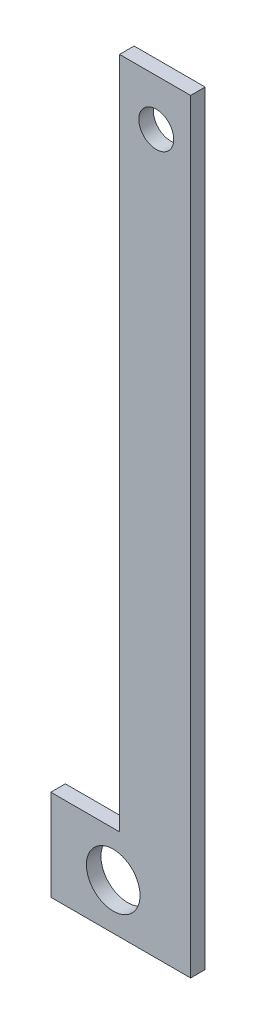
ISO-10303-21;
HEADER;
FILE_DESCRIPTION(('STEP AP214'),'2;1');
FILE_NAME('part.step','',(''),(''),'','','');
FILE_SCHEMA(('AUTOMOTIVE_DESIGN { 1 0 10303 214 1 1 1 1 }'));
ENDSEC;
DATA;
#1=APPLICATION_CONTEXT('core data for automotive mechanical design processes');
#2=APPLICATION_PROTOCOL_DEFINITION('international standard','automotive_design',2000,#1);
#3=PRODUCT_CONTEXT('',#1,'mechanical');
#4=PRODUCT('Part','Part','',(#3));
#5=PRODUCT_RELATED_PRODUCT_CATEGORY('part','',(#4));
#6=PRODUCT_DEFINITION_FORMATION('','',#4);
#7=PRODUCT_DEFINITION_CONTEXT('part definition',#1,'design');
#8=PRODUCT_DEFINITION('design','',#6,#7);
#9=PRODUCT_DEFINITION_SHAPE('','',#8);
#10=(LENGTH_UNIT() NAMED_UNIT(*) SI_UNIT(.MILLI.,.METRE.));
#11=(NAMED_UNIT(*) PLANE_ANGLE_UNIT() SI_UNIT($,.RADIAN.));
#12=(NAMED_UNIT(*) SI_UNIT($,.STERADIAN.) SOLID_ANGLE_UNIT());
#13=UNCERTAINTY_MEASURE_WITH_UNIT(LENGTH_MEASURE(1.E-05),#10,'distance_accuracy_value','');
#14=(GEOMETRIC_REPRESENTATION_CONTEXT(3) GLOBAL_UNCERTAINTY_ASSIGNED_CONTEXT((#13)) GLOBAL_UNIT_ASSIGNED_CONTEXT((#10,
#11,#12)) REPRESENTATION_CONTEXT('',''));
#15=CARTESIAN_POINT('',(0.,0.,0.));
#16=DIRECTION('',(0.,0.,1.));
#17=DIRECTION('',(1.,0.,0.));
#18=AXIS2_PLACEMENT_3D('',#15,#16,#17);
#19=CARTESIAN_POINT('',(-10.5266715270797,0.,3.));
#20=DIRECTION('',(-1.,0.,0.));
#21=DIRECTION('',(0.,0.,1.));
#22=AXIS2_PLACEMENT_3D('',#19,#20,#21);
#23=PLANE('',#22);
#24=DIRECTION('',(0.,1.,0.));
#25=VECTOR('',#24,1.);
#26=CARTESIAN_POINT('',(-10.5266715270797,0.,0.));
#27=LINE('',#26,#25);
#28=CARTESIAN_POINT('',(-10.5266715270797,-175.733774115841,0.));
#29=VERTEX_POINT('',#28);
#30=CARTESIAN_POINT('',(-10.5266715270797,-156.940093395301,0.));
#31=VERTEX_POINT('',#30);
#32=EDGE_CURVE('E127',#29,#31,#27,.T.);
#33=ORIENTED_EDGE('',*,*,#32,.F.);
#34=DIRECTION('',(0.,0.,-1.));
#35=VECTOR('',#34,1.);
#36=CARTESIAN_POINT('',(-10.5266715270797,-175.733774115841,3.));
#37=LINE('',#36,#35);
#38=CARTESIAN_POINT('',(-10.5266715270797,-175.733774115841,3.));
#39=VERTEX_POINT('',#38);
#40=EDGE_CURVE('E11',#39,#29,#37,.T.);
#41=ORIENTED_EDGE('',*,*,#40,.F.);
#42=DIRECTION('',(0.,1.,0.));
#43=VECTOR('',#42,1.);
#44=CARTESIAN_POINT('',(-10.5266715270797,0.,3.));
#45=LINE('',#44,#43);
#46=CARTESIAN_POINT('',(-10.5266715270797,-156.940093395301,3.));
#47=VERTEX_POINT('',#46);
#48=EDGE_CURVE('E183',#39,#47,#45,.T.);
#49=ORIENTED_EDGE('',*,*,#48,.T.);
#50=DIRECTION('',(0.,0.,-1.));
#51=VECTOR('',#50,1.);
#52=CARTESIAN_POINT('',(-10.5266715270797,-156.940093395301,3.));
#53=LINE('',#52,#51);
#54=EDGE_CURVE('E81',#47,#31,#53,.T.);
#55=ORIENTED_EDGE('',*,*,#54,.T.);
#56=EDGE_LOOP('',(#33,#41,#49,#55));
#57=FACE_BOUND('',#56,.T.);
#58=ADVANCED_FACE('F35',(#57),#23,.T.);
#59=CARTESIAN_POINT('',(0.,-175.733774115841,3.));
#60=DIRECTION('',(0.,-1.,0.));
#61=DIRECTION('',(0.,0.,-1.));
#62=AXIS2_PLACEMENT_3D('',#59,#60,#61);
#63=PLANE('',#62);
#64=DIRECTION('',(-1.,0.,0.));
#65=VECTOR('',#64,1.);
#66=CARTESIAN_POINT('',(0.,-175.733774115841,0.));
#67=LINE('',#66,#65);
#68=CARTESIAN_POINT('',(18.3464896356266,-175.733774115841,0.));
#69=VERTEX_POINT('',#68);
#70=EDGE_CURVE('E129',#69,#29,#67,.T.);
#71=ORIENTED_EDGE('',*,*,#70,.F.);
#72=DIRECTION('',(0.,0.,-1.));
#73=VECTOR('',#72,1.);
#74=CARTESIAN_POINT('',(18.3464896356266,-175.733774115841,3.));
#75=LINE('',#74,#73);
#76=CARTESIAN_POINT('',(18.3464896356266,-175.733774115841,3.));
#77=VERTEX_POINT('',#76);
#78=EDGE_CURVE('E44',#77,#69,#75,.T.);
#79=ORIENTED_EDGE('',*,*,#78,.F.);
#80=DIRECTION('',(-1.,0.,0.));
#81=VECTOR('',#80,1.);
#82=CARTESIAN_POINT('',(0.,-175.733774115841,3.));
#83=LINE('',#82,#81);
#84=EDGE_CURVE('E116',#77,#39,#83,.T.);
#85=ORIENTED_EDGE('',*,*,#84,.T.);
#86=ORIENTED_EDGE('',*,*,#40,.T.);
#87=EDGE_LOOP('',(#71,#79,#85,#86));
#88=FACE_BOUND('',#87,.T.);
#89=ADVANCED_FACE('F148',(#88),#63,.T.);
#90=CARTESIAN_POINT('',(18.3464896356266,0.,3.));
#91=DIRECTION('',(1.,0.,0.));
#92=DIRECTION('',(0.,0.,-1.));
#93=AXIS2_PLACEMENT_3D('',#90,#91,#92);
#94=PLANE('',#93);
#95=DIRECTION('',(0.,-1.,0.));
#96=VECTOR('',#95,1.);
#97=CARTESIAN_POINT('',(18.3464896356266,0.,0.));
#98=LINE('',#97,#96);
#99=CARTESIAN_POINT('',(18.3464896356266,-17.887190202817,0.));
#100=VERTEX_POINT('',#99);
#101=EDGE_CURVE('E132',#100,#69,#98,.T.);
#102=ORIENTED_EDGE('',*,*,#101,.F.);
#103=DIRECTION('',(0.,0.,-1.));
#104=VECTOR('',#103,1.);
#105=CARTESIAN_POINT('',(18.3464896356266,-17.887190202817,3.));
#106=LINE('',#105,#104);
#107=CARTESIAN_POINT('',(18.3464896356266,-17.887190202817,3.));
#108=VERTEX_POINT('',#107);
#109=EDGE_CURVE('E103',#108,#100,#106,.T.);
#110=ORIENTED_EDGE('',*,*,#109,.F.);
#111=DIRECTION('',(0.,-1.,0.));
#112=VECTOR('',#111,1.);
#113=CARTESIAN_POINT('',(18.3464896356266,0.,3.));
#114=LINE('',#113,#112);
#115=EDGE_CURVE('E114',#108,#77,#114,.T.);
#116=ORIENTED_EDGE('',*,*,#115,.T.);
#117=ORIENTED_EDGE('',*,*,#78,.T.);
#118=EDGE_LOOP('',(#102,#110,#116,#117));
#119=FACE_BOUND('',#118,.T.);
#120=ADVANCED_FACE('F145',(#119),#94,.T.);
#121=CARTESIAN_POINT('',(0.,-17.887190202817,3.));
#122=DIRECTION('',(0.,1.,0.));
#123=DIRECTION('',(0.,0.,1.));
#124=AXIS2_PLACEMENT_3D('',#121,#122,#123);
#125=PLANE('',#124);
#126=DIRECTION('',(1.,0.,0.));
#127=VECTOR('',#126,1.);
#128=CARTESIAN_POINT('',(0.,-17.887190202817,0.));
#129=LINE('',#128,#127);
#130=CARTESIAN_POINT('',(3.66616636260827,-17.887190202817,0.));
#131=VERTEX_POINT('',#130);
#132=EDGE_CURVE('E100',#131,#100,#129,.T.);
#133=ORIENTED_EDGE('',*,*,#132,.F.);
#134=DIRECTION('',(0.,0.,-1.));
#135=VECTOR('',#134,1.);
#136=CARTESIAN_POINT('',(3.66616636260827,-17.887190202817,3.));
#137=LINE('',#136,#135);
#138=CARTESIAN_POINT('',(3.66616636260827,-17.887190202817,3.));
#139=VERTEX_POINT('',#138);
#140=EDGE_CURVE('E94',#139,#131,#137,.T.);
#141=ORIENTED_EDGE('',*,*,#140,.F.);
#142=DIRECTION('',(1.,0.,0.));
#143=VECTOR('',#142,1.);
#144=CARTESIAN_POINT('',(0.,-17.887190202817,3.));
#145=LINE('',#144,#143);
#146=EDGE_CURVE('E98',#139,#108,#145,.T.);
#147=ORIENTED_EDGE('',*,*,#146,.T.);
#148=ORIENTED_EDGE('',*,*,#109,.T.);
#149=EDGE_LOOP('',(#133,#141,#147,#148));
#150=FACE_BOUND('',#149,.T.);
#151=ADVANCED_FACE('F96',(#150),#125,.T.);
#152=CARTESIAN_POINT('',(3.66616636260827,0.,3.));
#153=DIRECTION('',(1.,0.,0.));
#154=DIRECTION('',(0.,1.,0.));
#155=AXIS2_PLACEMENT_3D('',#152,#153,#154);
#156=PLANE('',#155);
#157=DIRECTION('',(0.,-1.,0.));
#158=VECTOR('',#157,1.);
#159=CARTESIAN_POINT('',(3.66616636260827,0.,0.));
#160=LINE('',#159,#158);
#161=CARTESIAN_POINT('',(3.66616636260827,-156.940093395301,0.));
#162=VERTEX_POINT('',#161);
#163=EDGE_CURVE('E136',#131,#162,#160,.T.);
#164=ORIENTED_EDGE('',*,*,#163,.T.);
#165=DIRECTION('',(0.,0.,-1.));
#166=VECTOR('',#165,1.);
#167=CARTESIAN_POINT('',(3.66616636260827,-156.940093395301,3.));
#168=LINE('',#167,#166);
#169=CARTESIAN_POINT('',(3.66616636260827,-156.940093395301,3.));
#170=VERTEX_POINT('',#169);
#171=EDGE_CURVE('E104',#170,#162,#168,.T.);
#172=ORIENTED_EDGE('',*,*,#171,.F.);
#173=DIRECTION('',(0.,-1.,0.));
#174=VECTOR('',#173,1.);
#175=CARTESIAN_POINT('',(3.66616636260827,0.,3.));
#176=LINE('',#175,#174);
#177=EDGE_CURVE('E107',#139,#170,#176,.T.);
#178=ORIENTED_EDGE('',*,*,#177,.F.);
#179=ORIENTED_EDGE('',*,*,#140,.T.);
#180=EDGE_LOOP('',(#164,#172,#178,#179));
#181=FACE_BOUND('',#180,.T.);
#182=ADVANCED_FACE('F108',(#181),#156,.F.);
#183=CARTESIAN_POINT('',(2.35723115612346,-166.225505798524,3.));
#184=DIRECTION('',(0.,0.,-1.));
#185=DIRECTION('',(-1.,0.,0.));
#186=AXIS2_PLACEMENT_3D('',#183,#184,#185);
#187=CYLINDRICAL_SURFACE('',#186,5.53692113350888);
#188=CARTESIAN_POINT('',(2.35723115612346,-166.225505798524,3.));
#189=DIRECTION('',(0.,0.,1.));
#190=DIRECTION('',(1.,0.,0.));
#191=AXIS2_PLACEMENT_3D('',#188,#189,#190);
#192=CIRCLE('',#191,5.53692113350888);
#193=CARTESIAN_POINT('',(7.89415228963234,-166.225505798524,3.));
#194=VERTEX_POINT('',#193);
#195=EDGE_CURVE('E180',#194,#194,#192,.T.);
#196=ORIENTED_EDGE('',*,*,#195,.T.);
#197=EDGE_LOOP('',(#196));
#198=FACE_BOUND('',#197,.T.);
#199=CARTESIAN_POINT('',(2.35723115612346,-166.225505798524,0.));
#200=DIRECTION('',(0.,0.,1.));
#201=DIRECTION('',(1.,0.,0.));
#202=AXIS2_PLACEMENT_3D('',#199,#200,#201);
#203=CIRCLE('',#202,5.53692113350888);
#204=CARTESIAN_POINT('',(7.89415228963234,-166.225505798524,0.));
#205=VERTEX_POINT('',#204);
#206=EDGE_CURVE('E124',#205,#205,#203,.T.);
#207=ORIENTED_EDGE('',*,*,#206,.F.);
#208=EDGE_LOOP('',(#207));
#209=FACE_BOUND('',#208,.T.);
#210=ADVANCED_FACE('F168',(#198,#209),#187,.F.);
#211=CARTESIAN_POINT('',(11.2499999999983,-27.5,3.));
#212=DIRECTION('',(0.,0.,-1.));
#213=DIRECTION('',(-1.,0.,0.));
#214=AXIS2_PLACEMENT_3D('',#211,#212,#213);
#215=CYLINDRICAL_SURFACE('',#214,3.604124075316);
#216=CARTESIAN_POINT('',(11.2499999999983,-27.5,3.));
#217=DIRECTION('',(0.,0.,1.));
#218=DIRECTION('',(1.,0.,0.));
#219=AXIS2_PLACEMENT_3D('',#216,#217,#218);
#220=CIRCLE('',#219,3.604124075316);
#221=CARTESIAN_POINT('',(14.8541240753143,-27.5,3.));
#222=VERTEX_POINT('',#221);
#223=EDGE_CURVE('E139',#222,#222,#220,.T.);
#224=ORIENTED_EDGE('',*,*,#223,.T.);
#225=EDGE_LOOP('',(#224));
#226=FACE_BOUND('',#225,.T.);
#227=CARTESIAN_POINT('',(11.2499999999983,-27.5,0.));
#228=DIRECTION('',(0.,0.,1.));
#229=DIRECTION('',(1.,0.,0.));
#230=AXIS2_PLACEMENT_3D('',#227,#228,#229);
#231=CIRCLE('',#230,3.604124075316);
#232=CARTESIAN_POINT('',(14.8541240753143,-27.5,0.));
#233=VERTEX_POINT('',#232);
#234=EDGE_CURVE('E121',#233,#233,#231,.T.);
#235=ORIENTED_EDGE('',*,*,#234,.F.);
#236=EDGE_LOOP('',(#235));
#237=FACE_BOUND('',#236,.T.);
#238=ADVANCED_FACE('F37',(#226,#237),#215,.F.);
#239=CARTESIAN_POINT('',(0.,-156.940093395301,3.));
#240=DIRECTION('',(0.,-1.,0.));
#241=DIRECTION('',(0.,0.,-1.));
#242=AXIS2_PLACEMENT_3D('',#239,#240,#241);
#243=PLANE('',#242);
#244=DIRECTION('',(-1.,0.,0.));
#245=VECTOR('',#244,1.);
#246=CARTESIAN_POINT('',(0.,-156.940093395301,0.));
#247=LINE('',#246,#245);
#248=EDGE_CURVE('E74',#162,#31,#247,.T.);
#249=ORIENTED_EDGE('',*,*,#248,.T.);
#250=ORIENTED_EDGE('',*,*,#54,.F.);
#251=DIRECTION('',(-1.,0.,0.));
#252=VECTOR('',#251,1.);
#253=CARTESIAN_POINT('',(0.,-156.940093395301,3.));
#254=LINE('',#253,#252);
#255=EDGE_CURVE('E52',#170,#47,#254,.T.);
#256=ORIENTED_EDGE('',*,*,#255,.F.);
#257=ORIENTED_EDGE('',*,*,#171,.T.);
#258=EDGE_LOOP('',(#249,#250,#256,#257));
#259=FACE_BOUND('',#258,.T.);
#260=ADVANCED_FACE('F156',(#259),#243,.F.);
#261=CARTESIAN_POINT('',(0.,0.,3.));
#262=DIRECTION('',(0.,0.,1.));
#263=DIRECTION('',(1.,0.,0.));
#264=AXIS2_PLACEMENT_3D('',#261,#262,#263);
#265=PLANE('',#264);
#266=ORIENTED_EDGE('',*,*,#223,.F.);
#267=EDGE_LOOP('',(#266));
#268=FACE_BOUND('',#267,.T.);
#269=ORIENTED_EDGE('',*,*,#195,.F.);
#270=EDGE_LOOP('',(#269));
#271=FACE_BOUND('',#270,.T.);
#272=ORIENTED_EDGE('',*,*,#48,.F.);
#273=ORIENTED_EDGE('',*,*,#84,.F.);
#274=ORIENTED_EDGE('',*,*,#115,.F.);
#275=ORIENTED_EDGE('',*,*,#146,.F.);
#276=ORIENTED_EDGE('',*,*,#177,.T.);
#277=ORIENTED_EDGE('',*,*,#255,.T.);
#278=EDGE_LOOP('',(#272,#273,#274,#275,#276,#277));
#279=FACE_BOUND('',#278,.T.);
#280=ADVANCED_FACE('F111',(#268,#271,#279),#265,.T.);
#281=CARTESIAN_POINT('',(0.,0.,0.));
#282=DIRECTION('',(0.,0.,1.));
#283=DIRECTION('',(1.,0.,0.));
#284=AXIS2_PLACEMENT_3D('',#281,#282,#283);
#285=PLANE('',#284);
#286=ORIENTED_EDGE('',*,*,#234,.T.);
#287=EDGE_LOOP('',(#286));
#288=FACE_BOUND('',#287,.T.);
#289=ORIENTED_EDGE('',*,*,#206,.T.);
#290=EDGE_LOOP('',(#289));
#291=FACE_BOUND('',#290,.T.);
#292=ORIENTED_EDGE('',*,*,#32,.T.);
#293=ORIENTED_EDGE('',*,*,#248,.F.);
#294=ORIENTED_EDGE('',*,*,#163,.F.);
#295=ORIENTED_EDGE('',*,*,#132,.T.);
#296=ORIENTED_EDGE('',*,*,#101,.T.);
#297=ORIENTED_EDGE('',*,*,#70,.T.);
#298=EDGE_LOOP('',(#292,#293,#294,#295,#296,#297));
#299=FACE_BOUND('',#298,.T.);
#300=ADVANCED_FACE('F149',(#288,#291,#299),#285,.F.);
#301=CLOSED_SHELL('',(#58,#89,#120,#151,#182,#210,#238,#260,#280,#300));
#302=MANIFOLD_SOLID_BREP('B2',#301);
#303=ADVANCED_BREP_SHAPE_REPRESENTATION('',(#18,#302),#14);
#304=SHAPE_DEFINITION_REPRESENTATION(#9,#303);
ENDSEC;
END-ISO-10303-21;
